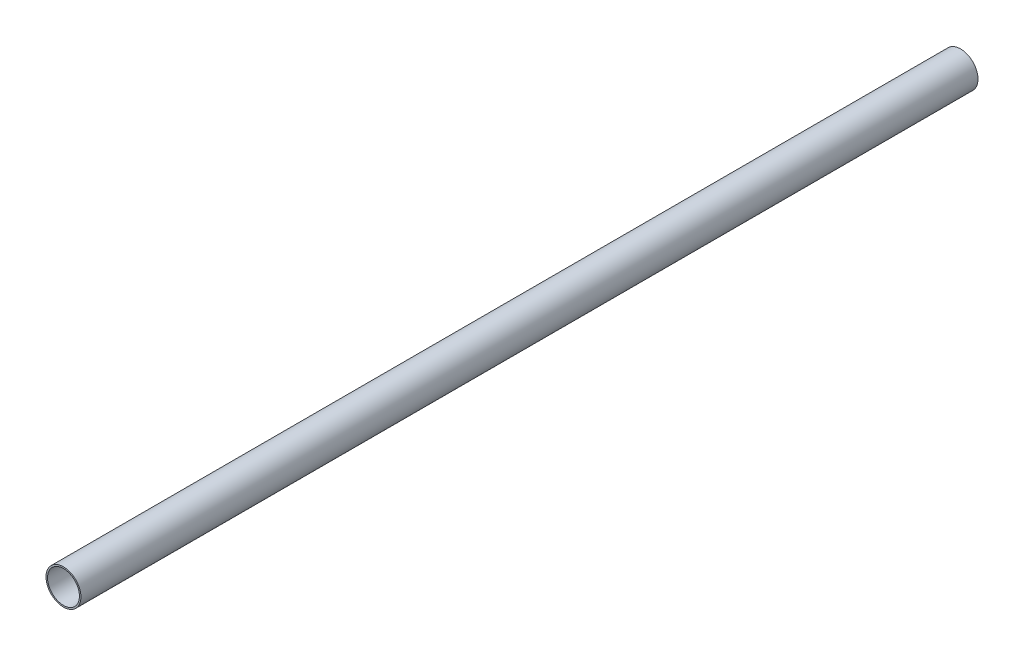
ISO-10303-21;
HEADER;
FILE_DESCRIPTION(('STEP AP214'),'2;1');
FILE_NAME('part.step','',(''),(''),'','','');
FILE_SCHEMA(('AUTOMOTIVE_DESIGN { 1 0 10303 214 1 1 1 1 }'));
ENDSEC;
DATA;
#1=APPLICATION_CONTEXT('core data for automotive mechanical design processes');
#2=APPLICATION_PROTOCOL_DEFINITION('international standard','automotive_design',2000,#1);
#3=PRODUCT_CONTEXT('',#1,'mechanical');
#4=PRODUCT('Part','Part','',(#3));
#5=PRODUCT_RELATED_PRODUCT_CATEGORY('part','',(#4));
#6=PRODUCT_DEFINITION_FORMATION('','',#4);
#7=PRODUCT_DEFINITION_CONTEXT('part definition',#1,'design');
#8=PRODUCT_DEFINITION('design','',#6,#7);
#9=PRODUCT_DEFINITION_SHAPE('','',#8);
#10=(LENGTH_UNIT() NAMED_UNIT(*) SI_UNIT(.MILLI.,.METRE.));
#11=(NAMED_UNIT(*) PLANE_ANGLE_UNIT() SI_UNIT($,.RADIAN.));
#12=(NAMED_UNIT(*) SI_UNIT($,.STERADIAN.) SOLID_ANGLE_UNIT());
#13=UNCERTAINTY_MEASURE_WITH_UNIT(LENGTH_MEASURE(1.E-05),#10,'distance_accuracy_value','');
#14=(GEOMETRIC_REPRESENTATION_CONTEXT(3) GLOBAL_UNCERTAINTY_ASSIGNED_CONTEXT((#13)) GLOBAL_UNIT_ASSIGNED_CONTEXT((#10,
#11,#12)) REPRESENTATION_CONTEXT('',''));
#15=CARTESIAN_POINT('',(0.,0.,0.));
#16=DIRECTION('',(0.,0.,1.));
#17=DIRECTION('',(1.,0.,0.));
#18=AXIS2_PLACEMENT_3D('',#15,#16,#17);
#19=CARTESIAN_POINT('',(0.,0.,0.));
#20=DIRECTION('',(0.,0.,-1.));
#21=DIRECTION('',(0.,-1.,0.));
#22=AXIS2_PLACEMENT_3D('',#19,#20,#21);
#23=CYLINDRICAL_SURFACE('',#22,17.399);
#24=CARTESIAN_POINT('',(0.,0.,-977.9));
#25=DIRECTION('',(0.,0.,1.));
#26=DIRECTION('',(1.,0.,0.));
#27=AXIS2_PLACEMENT_3D('',#24,#25,#26);
#28=CIRCLE('',#27,17.399);
#29=CARTESIAN_POINT('',(17.399,0.,-977.9));
#30=VERTEX_POINT('',#29);
#31=EDGE_CURVE('E25',#30,#30,#28,.T.);
#32=ORIENTED_EDGE('',*,*,#31,.F.);
#33=EDGE_LOOP('',(#32));
#34=FACE_BOUND('',#33,.T.);
#35=CARTESIAN_POINT('',(0.,0.,0.));
#36=DIRECTION('',(0.,0.,-1.));
#37=DIRECTION('',(0.,-1.,0.));
#38=AXIS2_PLACEMENT_3D('',#35,#36,#37);
#39=CIRCLE('',#38,17.399);
#40=CARTESIAN_POINT('',(0.,-17.399,0.));
#41=VERTEX_POINT('',#40);
#42=EDGE_CURVE('E29',#41,#41,#39,.T.);
#43=ORIENTED_EDGE('',*,*,#42,.F.);
#44=EDGE_LOOP('',(#43));
#45=FACE_BOUND('',#44,.T.);
#46=ADVANCED_FACE('F14',(#34,#45),#23,.F.);
#47=CARTESIAN_POINT('',(0.,0.,0.));
#48=DIRECTION('',(0.,0.,-1.));
#49=DIRECTION('',(0.,-1.,0.));
#50=AXIS2_PLACEMENT_3D('',#47,#48,#49);
#51=CYLINDRICAL_SURFACE('',#50,19.05);
#52=CARTESIAN_POINT('',(0.,0.,-977.9));
#53=DIRECTION('',(0.,0.,-1.));
#54=DIRECTION('',(0.,-1.,0.));
#55=AXIS2_PLACEMENT_3D('',#52,#53,#54);
#56=CIRCLE('',#55,19.05);
#57=CARTESIAN_POINT('',(0.,-19.05,-977.9));
#58=VERTEX_POINT('',#57);
#59=EDGE_CURVE('E21',#58,#58,#56,.T.);
#60=ORIENTED_EDGE('',*,*,#59,.F.);
#61=EDGE_LOOP('',(#60));
#62=FACE_BOUND('',#61,.T.);
#63=CARTESIAN_POINT('',(0.,0.,0.));
#64=DIRECTION('',(0.,0.,-1.));
#65=DIRECTION('',(0.,-1.,0.));
#66=AXIS2_PLACEMENT_3D('',#63,#64,#65);
#67=CIRCLE('',#66,19.05);
#68=CARTESIAN_POINT('',(0.,-19.05,0.));
#69=VERTEX_POINT('',#68);
#70=EDGE_CURVE('E9',#69,#69,#67,.T.);
#71=ORIENTED_EDGE('',*,*,#70,.T.);
#72=EDGE_LOOP('',(#71));
#73=FACE_BOUND('',#72,.T.);
#74=ADVANCED_FACE('F16',(#62,#73),#51,.T.);
#75=CARTESIAN_POINT('',(0.,0.,-977.9));
#76=DIRECTION('',(0.,0.,1.));
#77=DIRECTION('',(1.,0.,0.));
#78=AXIS2_PLACEMENT_3D('',#75,#76,#77);
#79=PLANE('',#78);
#80=ORIENTED_EDGE('',*,*,#59,.T.);
#81=EDGE_LOOP('',(#80));
#82=FACE_BOUND('',#81,.T.);
#83=ORIENTED_EDGE('',*,*,#31,.T.);
#84=EDGE_LOOP('',(#83));
#85=FACE_BOUND('',#84,.T.);
#86=ADVANCED_FACE('F43',(#82,#85),#79,.F.);
#87=CARTESIAN_POINT('',(0.,0.,0.));
#88=DIRECTION('',(0.,0.,1.));
#89=DIRECTION('',(1.,0.,0.));
#90=AXIS2_PLACEMENT_3D('',#87,#88,#89);
#91=PLANE('',#90);
#92=ORIENTED_EDGE('',*,*,#70,.F.);
#93=EDGE_LOOP('',(#92));
#94=FACE_BOUND('',#93,.T.);
#95=ORIENTED_EDGE('',*,*,#42,.T.);
#96=EDGE_LOOP('',(#95));
#97=FACE_BOUND('',#96,.T.);
#98=ADVANCED_FACE('F35',(#94,#97),#91,.T.);
#99=CLOSED_SHELL('',(#46,#74,#86,#98));
#100=MANIFOLD_SOLID_BREP('B1',#99);
#101=ADVANCED_BREP_SHAPE_REPRESENTATION('',(#18,#100),#14);
#102=SHAPE_DEFINITION_REPRESENTATION(#9,#101);
ENDSEC;
END-ISO-10303-21;
